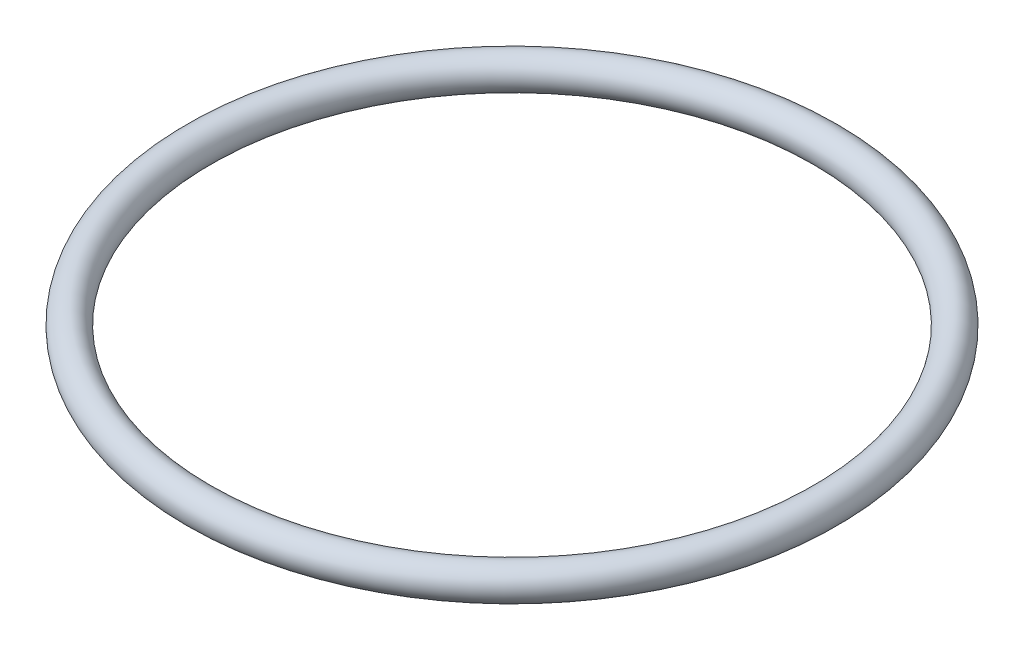
ISO-10303-21;
HEADER;
FILE_DESCRIPTION(('STEP AP214'),'2;1');
FILE_NAME('part.step','',(''),(''),'','','');
FILE_SCHEMA(('AUTOMOTIVE_DESIGN { 1 0 10303 214 1 1 1 1 }'));
ENDSEC;
DATA;
#1=APPLICATION_CONTEXT('core data for automotive mechanical design processes');
#2=APPLICATION_PROTOCOL_DEFINITION('international standard','automotive_design',2000,#1);
#3=PRODUCT_CONTEXT('',#1,'mechanical');
#4=PRODUCT('Part','Part','',(#3));
#5=PRODUCT_RELATED_PRODUCT_CATEGORY('part','',(#4));
#6=PRODUCT_DEFINITION_FORMATION('','',#4);
#7=PRODUCT_DEFINITION_CONTEXT('part definition',#1,'design');
#8=PRODUCT_DEFINITION('design','',#6,#7);
#9=PRODUCT_DEFINITION_SHAPE('','',#8);
#10=(LENGTH_UNIT() NAMED_UNIT(*) SI_UNIT(.MILLI.,.METRE.));
#11=(NAMED_UNIT(*) PLANE_ANGLE_UNIT() SI_UNIT($,.RADIAN.));
#12=(NAMED_UNIT(*) SI_UNIT($,.STERADIAN.) SOLID_ANGLE_UNIT());
#13=UNCERTAINTY_MEASURE_WITH_UNIT(LENGTH_MEASURE(1.E-05),#10,'distance_accuracy_value','');
#14=(GEOMETRIC_REPRESENTATION_CONTEXT(3) GLOBAL_UNCERTAINTY_ASSIGNED_CONTEXT((#13)) GLOBAL_UNIT_ASSIGNED_CONTEXT((#10,
#11,#12)) REPRESENTATION_CONTEXT('',''));
#15=CARTESIAN_POINT('',(0.,0.,0.));
#16=DIRECTION('',(0.,0.,1.));
#17=DIRECTION('',(1.,0.,0.));
#18=AXIS2_PLACEMENT_3D('',#15,#16,#17);
#19=CARTESIAN_POINT('',(-11.294283039,16.572504608,0.));
#20=DIRECTION('',(0.,1.,0.));
#21=DIRECTION('',(0.,0.,1.));
#22=AXIS2_PLACEMENT_3D('',#19,#20,#21);
#23=TOROIDAL_SURFACE('',#22,16.89,0.89);
#24=CARTESIAN_POINT('',(-11.294283039,16.572504608,17.78));
#25=VERTEX_POINT('',#24);
#26=VERTEX_LOOP('',#25);
#27=FACE_BOUND('',#26,.T.);
#28=ADVANCED_FACE('F13',(#27),#23,.T.);
#29=CLOSED_SHELL('',(#28));
#30=MANIFOLD_SOLID_BREP('B1',#29);
#31=ADVANCED_BREP_SHAPE_REPRESENTATION('',(#18,#30),#14);
#32=SHAPE_DEFINITION_REPRESENTATION(#9,#31);
ENDSEC;
END-ISO-10303-21;
